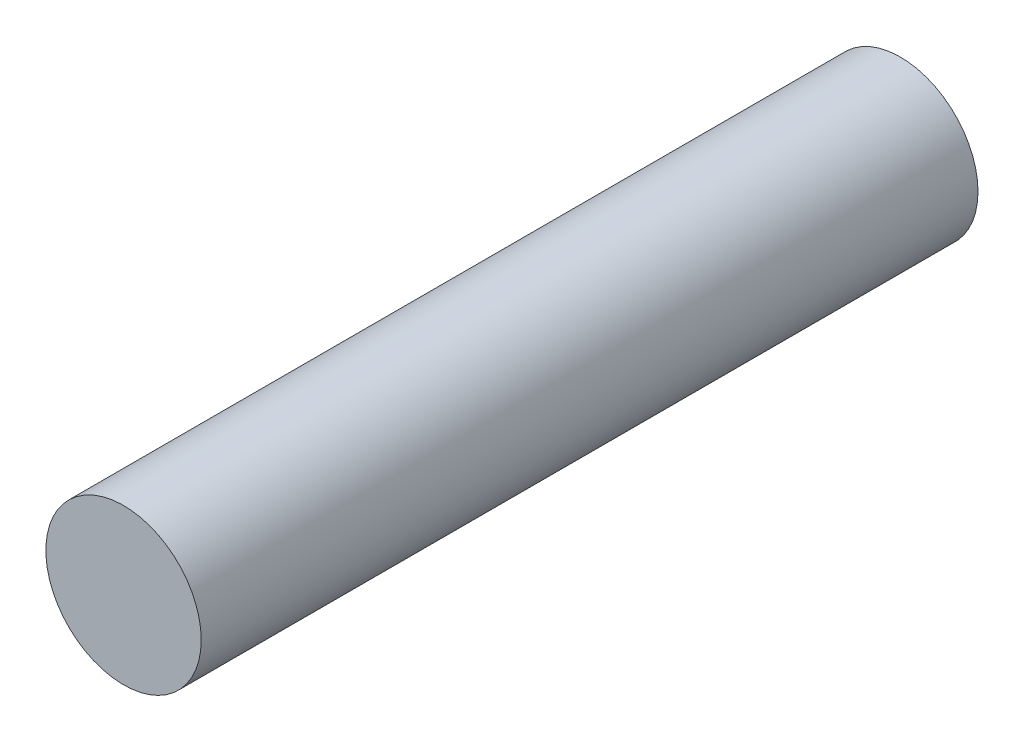
ISO-10303-21;
HEADER;
FILE_DESCRIPTION(('STEP AP214'),'2;1');
FILE_NAME('part.step','',(''),(''),'','','');
FILE_SCHEMA(('AUTOMOTIVE_DESIGN { 1 0 10303 214 1 1 1 1 }'));
ENDSEC;
DATA;
#1=APPLICATION_CONTEXT('core data for automotive mechanical design processes');
#2=APPLICATION_PROTOCOL_DEFINITION('international standard','automotive_design',2000,#1);
#3=PRODUCT_CONTEXT('',#1,'mechanical');
#4=PRODUCT('Part','Part','',(#3));
#5=PRODUCT_RELATED_PRODUCT_CATEGORY('part','',(#4));
#6=PRODUCT_DEFINITION_FORMATION('','',#4);
#7=PRODUCT_DEFINITION_CONTEXT('part definition',#1,'design');
#8=PRODUCT_DEFINITION('design','',#6,#7);
#9=PRODUCT_DEFINITION_SHAPE('','',#8);
#10=(LENGTH_UNIT() NAMED_UNIT(*) SI_UNIT(.MILLI.,.METRE.));
#11=(NAMED_UNIT(*) PLANE_ANGLE_UNIT() SI_UNIT($,.RADIAN.));
#12=(NAMED_UNIT(*) SI_UNIT($,.STERADIAN.) SOLID_ANGLE_UNIT());
#13=UNCERTAINTY_MEASURE_WITH_UNIT(LENGTH_MEASURE(1.E-05),#10,'distance_accuracy_value','');
#14=(GEOMETRIC_REPRESENTATION_CONTEXT(3) GLOBAL_UNCERTAINTY_ASSIGNED_CONTEXT((#13)) GLOBAL_UNIT_ASSIGNED_CONTEXT((#10,
#11,#12)) REPRESENTATION_CONTEXT('',''));
#15=CARTESIAN_POINT('',(0.,0.,0.));
#16=DIRECTION('',(0.,0.,1.));
#17=DIRECTION('',(1.,0.,0.));
#18=AXIS2_PLACEMENT_3D('',#15,#16,#17);
#19=CARTESIAN_POINT('',(0.,0.,15.875));
#20=DIRECTION('',(0.,0.,-1.));
#21=DIRECTION('',(-1.,0.,0.));
#22=AXIS2_PLACEMENT_3D('',#19,#20,#21);
#23=CYLINDRICAL_SURFACE('',#22,1.5875);
#24=CARTESIAN_POINT('',(0.,0.,15.875));
#25=DIRECTION('',(0.,0.,1.));
#26=DIRECTION('',(1.,0.,0.));
#27=AXIS2_PLACEMENT_3D('',#24,#25,#26);
#28=CIRCLE('',#27,1.5875);
#29=CARTESIAN_POINT('',(1.5875,0.,15.875));
#30=VERTEX_POINT('',#29);
#31=EDGE_CURVE('E10',#30,#30,#28,.T.);
#32=ORIENTED_EDGE('',*,*,#31,.F.);
#33=EDGE_LOOP('',(#32));
#34=FACE_BOUND('',#33,.T.);
#35=CARTESIAN_POINT('',(0.,0.,0.));
#36=DIRECTION('',(0.,0.,1.));
#37=DIRECTION('',(1.,0.,0.));
#38=AXIS2_PLACEMENT_3D('',#35,#36,#37);
#39=CIRCLE('',#38,1.5875);
#40=CARTESIAN_POINT('',(1.5875,0.,0.));
#41=VERTEX_POINT('',#40);
#42=EDGE_CURVE('E40',#41,#41,#39,.T.);
#43=ORIENTED_EDGE('',*,*,#42,.T.);
#44=EDGE_LOOP('',(#43));
#45=FACE_BOUND('',#44,.T.);
#46=ADVANCED_FACE('F37',(#34,#45),#23,.T.);
#47=CARTESIAN_POINT('',(0.,0.,15.875));
#48=DIRECTION('',(0.,0.,1.));
#49=DIRECTION('',(1.,0.,0.));
#50=AXIS2_PLACEMENT_3D('',#47,#48,#49);
#51=PLANE('',#50);
#52=ORIENTED_EDGE('',*,*,#31,.T.);
#53=EDGE_LOOP('',(#52));
#54=FACE_BOUND('',#53,.T.);
#55=ADVANCED_FACE('F54',(#54),#51,.T.);
#56=CARTESIAN_POINT('',(0.,0.,0.));
#57=DIRECTION('',(0.,0.,1.));
#58=DIRECTION('',(1.,0.,0.));
#59=AXIS2_PLACEMENT_3D('',#56,#57,#58);
#60=PLANE('',#59);
#61=ORIENTED_EDGE('',*,*,#42,.F.);
#62=EDGE_LOOP('',(#61));
#63=FACE_BOUND('',#62,.T.);
#64=ADVANCED_FACE('F52',(#63),#60,.F.);
#65=CLOSED_SHELL('',(#46,#55,#64));
#66=MANIFOLD_SOLID_BREP('B2',#65);
#67=ADVANCED_BREP_SHAPE_REPRESENTATION('',(#18,#66),#14);
#68=SHAPE_DEFINITION_REPRESENTATION(#9,#67);
ENDSEC;
END-ISO-10303-21;
